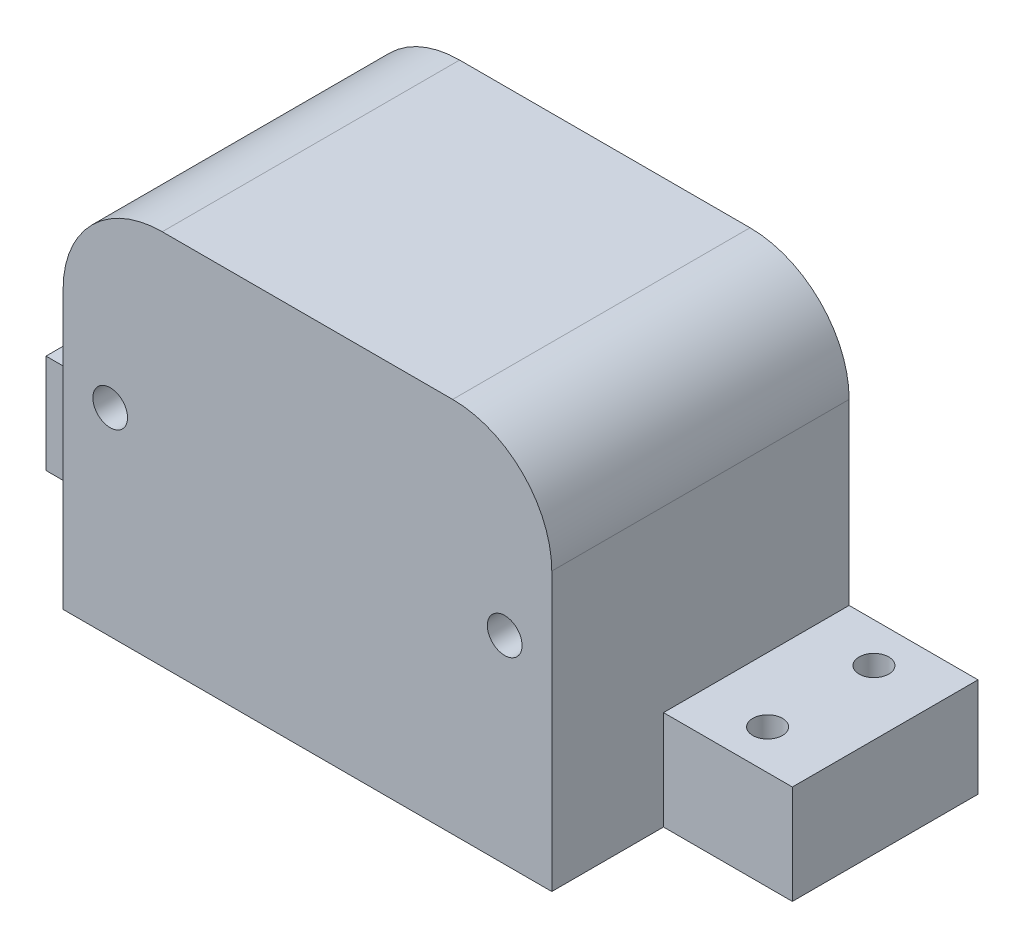
ISO-10303-21;
HEADER;
FILE_DESCRIPTION(('STEP AP214'),'2;1');
FILE_NAME('part.step','',(''),(''),'','','');
FILE_SCHEMA(('AUTOMOTIVE_DESIGN { 1 0 10303 214 1 1 1 1 }'));
ENDSEC;
DATA;
#1=APPLICATION_CONTEXT('core data for automotive mechanical design processes');
#2=APPLICATION_PROTOCOL_DEFINITION('international standard','automotive_design',2000,#1);
#3=PRODUCT_CONTEXT('',#1,'mechanical');
#4=PRODUCT('Part','Part','',(#3));
#5=PRODUCT_RELATED_PRODUCT_CATEGORY('part','',(#4));
#6=PRODUCT_DEFINITION_FORMATION('','',#4);
#7=PRODUCT_DEFINITION_CONTEXT('part definition',#1,'design');
#8=PRODUCT_DEFINITION('design','',#6,#7);
#9=PRODUCT_DEFINITION_SHAPE('','',#8);
#10=(LENGTH_UNIT() NAMED_UNIT(*) SI_UNIT(.MILLI.,.METRE.));
#11=(NAMED_UNIT(*) PLANE_ANGLE_UNIT() SI_UNIT($,.RADIAN.));
#12=(NAMED_UNIT(*) SI_UNIT($,.STERADIAN.) SOLID_ANGLE_UNIT());
#13=UNCERTAINTY_MEASURE_WITH_UNIT(LENGTH_MEASURE(1.E-05),#10,'distance_accuracy_value','');
#14=(GEOMETRIC_REPRESENTATION_CONTEXT(3) GLOBAL_UNCERTAINTY_ASSIGNED_CONTEXT((#13)) GLOBAL_UNIT_ASSIGNED_CONTEXT((#10,
#11,#12)) REPRESENTATION_CONTEXT('',''));
#15=CARTESIAN_POINT('',(0.,0.,0.));
#16=DIRECTION('',(0.,0.,1.));
#17=DIRECTION('',(1.,0.,0.));
#18=AXIS2_PLACEMENT_3D('',#15,#16,#17);
#19=CARTESIAN_POINT('',(0.,-19.,30.));
#20=DIRECTION('',(0.,1.,0.));
#21=DIRECTION('',(0.,0.,1.));
#22=AXIS2_PLACEMENT_3D('',#19,#20,#21);
#23=PLANE('',#22);
#24=CARTESIAN_POINT('',(31.15,-19.,3.99999999999999));
#25=DIRECTION('',(0.,1.,0.));
#26=DIRECTION('',(0.,0.,1.));
#27=AXIS2_PLACEMENT_3D('',#24,#25,#26);
#28=CIRCLE('',#27,1.49999999999999);
#29=CARTESIAN_POINT('',(31.15,-19.,5.49999999999998));
#30=VERTEX_POINT('',#29);
#31=EDGE_CURVE('E244',#30,#30,#28,.T.);
#32=ORIENTED_EDGE('',*,*,#31,.T.);
#33=EDGE_LOOP('',(#32));
#34=FACE_BOUND('',#33,.T.);
#35=CARTESIAN_POINT('',(31.15,-19.,14.7279854884588));
#36=DIRECTION('',(0.,1.,0.));
#37=DIRECTION('',(0.,0.,1.));
#38=AXIS2_PLACEMENT_3D('',#35,#36,#37);
#39=CIRCLE('',#38,1.5);
#40=CARTESIAN_POINT('',(31.15,-19.,16.2279854884588));
#41=VERTEX_POINT('',#40);
#42=EDGE_CURVE('E257',#41,#41,#39,.T.);
#43=ORIENTED_EDGE('',*,*,#42,.T.);
#44=EDGE_LOOP('',(#43));
#45=FACE_BOUND('',#44,.T.);
#46=CARTESIAN_POINT('',(-31.15,-19.,14.7279854884588));
#47=DIRECTION('',(0.,1.,0.));
#48=DIRECTION('',(0.,0.,1.));
#49=AXIS2_PLACEMENT_3D('',#46,#47,#48);
#50=CIRCLE('',#49,1.5);
#51=CARTESIAN_POINT('',(-31.15,-19.,16.2279854884588));
#52=VERTEX_POINT('',#51);
#53=EDGE_CURVE('E260',#52,#52,#50,.T.);
#54=ORIENTED_EDGE('',*,*,#53,.T.);
#55=EDGE_LOOP('',(#54));
#56=FACE_BOUND('',#55,.T.);
#57=CARTESIAN_POINT('',(-31.15,-19.,4.));
#58=DIRECTION('',(0.,1.,0.));
#59=DIRECTION('',(0.,0.,1.));
#60=AXIS2_PLACEMENT_3D('',#57,#58,#59);
#61=CIRCLE('',#60,1.5);
#62=CARTESIAN_POINT('',(-31.15,-19.,5.5));
#63=VERTEX_POINT('',#62);
#64=EDGE_CURVE('E263',#63,#63,#61,.T.);
#65=ORIENTED_EDGE('',*,*,#64,.T.);
#66=EDGE_LOOP('',(#65));
#67=FACE_BOUND('',#66,.T.);
#68=DIRECTION('',(-1.,0.,0.));
#69=VECTOR('',#68,1.);
#70=CARTESIAN_POINT('',(0.,-19.,18.7279854884588));
#71=LINE('',#70,#69);
#72=CARTESIAN_POINT('',(37.65,-19.,18.7279854884588));
#73=VERTEX_POINT('',#72);
#74=CARTESIAN_POINT('',(24.65,-19.,18.7279854884588));
#75=VERTEX_POINT('',#74);
#76=EDGE_CURVE('E242',#73,#75,#71,.T.);
#77=ORIENTED_EDGE('',*,*,#76,.T.);
#78=DIRECTION('',(0.,0.,1.));
#79=VECTOR('',#78,1.);
#80=CARTESIAN_POINT('',(24.65,-19.,30.));
#81=LINE('',#80,#79);
#82=CARTESIAN_POINT('',(24.65,-19.,30.));
#83=VERTEX_POINT('',#82);
#84=EDGE_CURVE('E137',#75,#83,#81,.T.);
#85=ORIENTED_EDGE('',*,*,#84,.T.);
#86=DIRECTION('',(1.,0.,0.));
#87=VECTOR('',#86,1.);
#88=CARTESIAN_POINT('',(0.,-19.,30.));
#89=LINE('',#88,#87);
#90=CARTESIAN_POINT('',(-24.65,-19.,30.));
#91=VERTEX_POINT('',#90);
#92=EDGE_CURVE('E219',#91,#83,#89,.T.);
#93=ORIENTED_EDGE('',*,*,#92,.F.);
#94=DIRECTION('',(0.,0.,-1.));
#95=VECTOR('',#94,1.);
#96=CARTESIAN_POINT('',(-24.65,-19.,30.));
#97=LINE('',#96,#95);
#98=CARTESIAN_POINT('',(-24.65,-19.,18.7279854884588));
#99=VERTEX_POINT('',#98);
#100=EDGE_CURVE('E270',#91,#99,#97,.T.);
#101=ORIENTED_EDGE('',*,*,#100,.T.);
#102=DIRECTION('',(-1.,0.,0.));
#103=VECTOR('',#102,1.);
#104=CARTESIAN_POINT('',(0.,-19.,18.7279854884588));
#105=LINE('',#104,#103);
#106=CARTESIAN_POINT('',(-37.65,-19.,18.7279854884588));
#107=VERTEX_POINT('',#106);
#108=EDGE_CURVE('E266',#99,#107,#105,.T.);
#109=ORIENTED_EDGE('',*,*,#108,.T.);
#110=DIRECTION('',(0.,0.,-1.));
#111=VECTOR('',#110,1.);
#112=CARTESIAN_POINT('',(-37.65,-19.,30.));
#113=LINE('',#112,#111);
#114=CARTESIAN_POINT('',(-37.65,-19.,0.));
#115=VERTEX_POINT('',#114);
#116=EDGE_CURVE('E220',#107,#115,#113,.T.);
#117=ORIENTED_EDGE('',*,*,#116,.T.);
#118=DIRECTION('',(1.,0.,0.));
#119=VECTOR('',#118,1.);
#120=CARTESIAN_POINT('',(0.,-19.,0.));
#121=LINE('',#120,#119);
#122=CARTESIAN_POINT('',(37.65,-19.,0.));
#123=VERTEX_POINT('',#122);
#124=EDGE_CURVE('E238',#115,#123,#121,.T.);
#125=ORIENTED_EDGE('',*,*,#124,.T.);
#126=DIRECTION('',(0.,0.,-1.));
#127=VECTOR('',#126,1.);
#128=CARTESIAN_POINT('',(37.65,-19.,30.));
#129=LINE('',#128,#127);
#130=EDGE_CURVE('E158',#73,#123,#129,.T.);
#131=ORIENTED_EDGE('',*,*,#130,.F.);
#132=EDGE_LOOP('',(#77,#85,#93,#101,#109,#117,#125,#131));
#133=FACE_BOUND('',#132,.T.);
#134=ADVANCED_FACE('F41',(#34,#45,#56,#67,#133),#23,.F.);
#135=CARTESIAN_POINT('',(37.65,0.,30.));
#136=DIRECTION('',(1.,0.,0.));
#137=DIRECTION('',(0.,0.,-1.));
#138=AXIS2_PLACEMENT_3D('',#135,#136,#137);
#139=PLANE('',#138);
#140=DIRECTION('',(0.,1.,0.));
#141=VECTOR('',#140,1.);
#142=CARTESIAN_POINT('',(37.65,-29.,18.7279854884588));
#143=LINE('',#142,#141);
#144=CARTESIAN_POINT('',(37.65,-9.,18.7279854884588));
#145=VERTEX_POINT('',#144);
#146=EDGE_CURVE('E140',#73,#145,#143,.T.);
#147=ORIENTED_EDGE('',*,*,#146,.F.);
#148=ORIENTED_EDGE('',*,*,#130,.T.);
#149=DIRECTION('',(0.,-1.,0.));
#150=VECTOR('',#149,1.);
#151=CARTESIAN_POINT('',(37.65,0.,0.));
#152=LINE('',#151,#150);
#153=CARTESIAN_POINT('',(37.65,-9.00000000000001,0.));
#154=VERTEX_POINT('',#153);
#155=EDGE_CURVE('E201',#154,#123,#152,.T.);
#156=ORIENTED_EDGE('',*,*,#155,.F.);
#157=DIRECTION('',(0.,0.,-1.));
#158=VECTOR('',#157,1.);
#159=CARTESIAN_POINT('',(37.65,-9.00000000000001,30.));
#160=LINE('',#159,#158);
#161=EDGE_CURVE('E155',#145,#154,#160,.T.);
#162=ORIENTED_EDGE('',*,*,#161,.F.);
#163=EDGE_LOOP('',(#147,#148,#156,#162));
#164=FACE_BOUND('',#163,.T.);
#165=ADVANCED_FACE('F310',(#164),#139,.T.);
#166=CARTESIAN_POINT('',(0.,-9.,30.));
#167=DIRECTION('',(0.,1.,0.));
#168=DIRECTION('',(-1.,0.,0.));
#169=AXIS2_PLACEMENT_3D('',#166,#167,#168);
#170=PLANE('',#169);
#171=DIRECTION('',(-1.,0.,0.));
#172=VECTOR('',#171,1.);
#173=CARTESIAN_POINT('',(24.65,-9.,18.7279854884588));
#174=LINE('',#173,#172);
#175=CARTESIAN_POINT('',(24.65,-9.,18.7279854884588));
#176=VERTEX_POINT('',#175);
#177=EDGE_CURVE('E143',#145,#176,#174,.T.);
#178=ORIENTED_EDGE('',*,*,#177,.F.);
#179=ORIENTED_EDGE('',*,*,#161,.T.);
#180=DIRECTION('',(1.,0.,0.));
#181=VECTOR('',#180,1.);
#182=CARTESIAN_POINT('',(0.,-9.,0.));
#183=LINE('',#182,#181);
#184=CARTESIAN_POINT('',(24.65,-9.00000000000001,0.));
#185=VERTEX_POINT('',#184);
#186=EDGE_CURVE('E154',#185,#154,#183,.T.);
#187=ORIENTED_EDGE('',*,*,#186,.F.);
#188=DIRECTION('',(0.,0.,-1.));
#189=VECTOR('',#188,1.);
#190=CARTESIAN_POINT('',(24.65,-9.00000000000001,30.));
#191=LINE('',#190,#189);
#192=EDGE_CURVE('E134',#176,#185,#191,.T.);
#193=ORIENTED_EDGE('',*,*,#192,.F.);
#194=EDGE_LOOP('',(#178,#179,#187,#193));
#195=FACE_BOUND('',#194,.T.);
#196=CARTESIAN_POINT('',(31.15,-9.,3.99999999999999));
#197=DIRECTION('',(0.,1.,0.));
#198=DIRECTION('',(1.,0.,0.));
#199=AXIS2_PLACEMENT_3D('',#196,#197,#198);
#200=CIRCLE('',#199,1.49999999999999);
#201=CARTESIAN_POINT('',(32.65,-9.,3.99999999999999));
#202=VERTEX_POINT('',#201);
#203=EDGE_CURVE('E148',#202,#202,#200,.T.);
#204=ORIENTED_EDGE('',*,*,#203,.F.);
#205=EDGE_LOOP('',(#204));
#206=FACE_BOUND('',#205,.T.);
#207=CARTESIAN_POINT('',(31.15,-9.,14.7279854884588));
#208=DIRECTION('',(0.,1.,0.));
#209=DIRECTION('',(1.,0.,0.));
#210=AXIS2_PLACEMENT_3D('',#207,#208,#209);
#211=CIRCLE('',#210,1.5);
#212=CARTESIAN_POINT('',(32.65,-9.,14.7279854884588));
#213=VERTEX_POINT('',#212);
#214=EDGE_CURVE('E282',#213,#213,#211,.T.);
#215=ORIENTED_EDGE('',*,*,#214,.F.);
#216=EDGE_LOOP('',(#215));
#217=FACE_BOUND('',#216,.T.);
#218=ADVANCED_FACE('F151',(#195,#206,#217),#170,.T.);
#219=CARTESIAN_POINT('',(24.65,0.,30.));
#220=DIRECTION('',(-1.,0.,0.));
#221=DIRECTION('',(0.,0.,1.));
#222=AXIS2_PLACEMENT_3D('',#219,#220,#221);
#223=PLANE('',#222);
#224=DIRECTION('',(0.,1.,0.));
#225=VECTOR('',#224,1.);
#226=CARTESIAN_POINT('',(24.65,0.,0.));
#227=LINE('',#226,#225);
#228=CARTESIAN_POINT('',(24.65,9.,0.));
#229=VERTEX_POINT('',#228);
#230=EDGE_CURVE('E196',#185,#229,#227,.T.);
#231=ORIENTED_EDGE('',*,*,#230,.T.);
#232=DIRECTION('',(0.,0.,-1.));
#233=VECTOR('',#232,1.);
#234=CARTESIAN_POINT('',(24.65,9.,30.));
#235=LINE('',#234,#233);
#236=CARTESIAN_POINT('',(24.65,9.,30.));
#237=VERTEX_POINT('',#236);
#238=EDGE_CURVE('E174',#229,#237,#235,.F.);
#239=ORIENTED_EDGE('',*,*,#238,.T.);
#240=DIRECTION('',(0.,1.,0.));
#241=VECTOR('',#240,1.);
#242=CARTESIAN_POINT('',(24.65,0.,30.));
#243=LINE('',#242,#241);
#244=EDGE_CURVE('E182',#83,#237,#243,.T.);
#245=ORIENTED_EDGE('',*,*,#244,.F.);
#246=ORIENTED_EDGE('',*,*,#84,.F.);
#247=DIRECTION('',(0.,1.,0.));
#248=VECTOR('',#247,1.);
#249=CARTESIAN_POINT('',(24.65,-29.,18.7279854884588));
#250=LINE('',#249,#248);
#251=EDGE_CURVE('E129',#75,#176,#250,.T.);
#252=ORIENTED_EDGE('',*,*,#251,.T.);
#253=ORIENTED_EDGE('',*,*,#192,.T.);
#254=EDGE_LOOP('',(#231,#239,#245,#246,#252,#253));
#255=FACE_BOUND('',#254,.T.);
#256=ADVANCED_FACE('F132',(#255),#223,.F.);
#257=CARTESIAN_POINT('',(0.,19.,30.));
#258=DIRECTION('',(0.,1.,0.));
#259=DIRECTION('',(0.,0.,1.));
#260=AXIS2_PLACEMENT_3D('',#257,#258,#259);
#261=PLANE('',#260);
#262=DIRECTION('',(1.,0.,0.));
#263=VECTOR('',#262,1.);
#264=CARTESIAN_POINT('',(0.,19.,30.));
#265=LINE('',#264,#263);
#266=CARTESIAN_POINT('',(-14.65,19.,30.));
#267=VERTEX_POINT('',#266);
#268=CARTESIAN_POINT('',(14.65,19.,30.));
#269=VERTEX_POINT('',#268);
#270=EDGE_CURVE('E181',#267,#269,#265,.T.);
#271=ORIENTED_EDGE('',*,*,#270,.T.);
#272=DIRECTION('',(0.,0.,-1.));
#273=VECTOR('',#272,1.);
#274=CARTESIAN_POINT('',(14.65,19.,0.));
#275=LINE('',#274,#273);
#276=CARTESIAN_POINT('',(14.65,19.,0.));
#277=VERTEX_POINT('',#276);
#278=EDGE_CURVE('E167',#269,#277,#275,.T.);
#279=ORIENTED_EDGE('',*,*,#278,.T.);
#280=DIRECTION('',(1.,0.,0.));
#281=VECTOR('',#280,1.);
#282=CARTESIAN_POINT('',(0.,19.,0.));
#283=LINE('',#282,#281);
#284=CARTESIAN_POINT('',(-14.65,19.,0.));
#285=VERTEX_POINT('',#284);
#286=EDGE_CURVE('E197',#285,#277,#283,.T.);
#287=ORIENTED_EDGE('',*,*,#286,.F.);
#288=DIRECTION('',(0.,0.,-1.));
#289=VECTOR('',#288,1.);
#290=CARTESIAN_POINT('',(-14.65,19.,30.));
#291=LINE('',#290,#289);
#292=EDGE_CURVE('E165',#285,#267,#291,.F.);
#293=ORIENTED_EDGE('',*,*,#292,.T.);
#294=EDGE_LOOP('',(#271,#279,#287,#293));
#295=FACE_BOUND('',#294,.T.);
#296=ADVANCED_FACE('F187',(#295),#261,.T.);
#297=CARTESIAN_POINT('',(-24.65,0.,30.));
#298=DIRECTION('',(-1.,0.,0.));
#299=DIRECTION('',(0.,0.,1.));
#300=AXIS2_PLACEMENT_3D('',#297,#298,#299);
#301=PLANE('',#300);
#302=DIRECTION('',(0.,1.,0.));
#303=VECTOR('',#302,1.);
#304=CARTESIAN_POINT('',(-24.65,0.,30.));
#305=LINE('',#304,#303);
#306=CARTESIAN_POINT('',(-24.65,9.,30.));
#307=VERTEX_POINT('',#306);
#308=EDGE_CURVE('E56',#91,#307,#305,.T.);
#309=ORIENTED_EDGE('',*,*,#308,.T.);
#310=DIRECTION('',(0.,0.,-1.));
#311=VECTOR('',#310,1.);
#312=CARTESIAN_POINT('',(-24.65,9.,30.));
#313=LINE('',#312,#311);
#314=CARTESIAN_POINT('',(-24.65,9.,0.));
#315=VERTEX_POINT('',#314);
#316=EDGE_CURVE('E11',#307,#315,#313,.T.);
#317=ORIENTED_EDGE('',*,*,#316,.T.);
#318=DIRECTION('',(0.,1.,0.));
#319=VECTOR('',#318,1.);
#320=CARTESIAN_POINT('',(-24.65,0.,0.));
#321=LINE('',#320,#319);
#322=CARTESIAN_POINT('',(-24.65,-9.00000000000001,0.));
#323=VERTEX_POINT('',#322);
#324=EDGE_CURVE('E199',#323,#315,#321,.T.);
#325=ORIENTED_EDGE('',*,*,#324,.F.);
#326=DIRECTION('',(0.,0.,-1.));
#327=VECTOR('',#326,1.);
#328=CARTESIAN_POINT('',(-24.65,-9.00000000000001,30.));
#329=LINE('',#328,#327);
#330=CARTESIAN_POINT('',(-24.65,-9.00000000000001,18.7279854884588));
#331=VERTEX_POINT('',#330);
#332=EDGE_CURVE('E156',#331,#323,#329,.T.);
#333=ORIENTED_EDGE('',*,*,#332,.F.);
#334=DIRECTION('',(0.,1.,0.));
#335=VECTOR('',#334,1.);
#336=CARTESIAN_POINT('',(-24.65,-29.,18.7279854884588));
#337=LINE('',#336,#335);
#338=EDGE_CURVE('E273',#99,#331,#337,.T.);
#339=ORIENTED_EDGE('',*,*,#338,.F.);
#340=ORIENTED_EDGE('',*,*,#100,.F.);
#341=EDGE_LOOP('',(#309,#317,#325,#333,#339,#340));
#342=FACE_BOUND('',#341,.T.);
#343=ADVANCED_FACE('F296',(#342),#301,.T.);
#344=CARTESIAN_POINT('',(0.,-9.,30.));
#345=DIRECTION('',(0.,-1.,0.));
#346=DIRECTION('',(1.,0.,0.));
#347=AXIS2_PLACEMENT_3D('',#344,#345,#346);
#348=PLANE('',#347);
#349=CARTESIAN_POINT('',(-31.15,-9.00000000000001,14.7279854884588));
#350=DIRECTION('',(0.,1.,0.));
#351=DIRECTION('',(-1.,0.,0.));
#352=AXIS2_PLACEMENT_3D('',#349,#350,#351);
#353=CIRCLE('',#352,1.5);
#354=CARTESIAN_POINT('',(-32.65,-9.00000000000001,14.7279854884588));
#355=VERTEX_POINT('',#354);
#356=EDGE_CURVE('E285',#355,#355,#353,.T.);
#357=ORIENTED_EDGE('',*,*,#356,.F.);
#358=EDGE_LOOP('',(#357));
#359=FACE_BOUND('',#358,.T.);
#360=CARTESIAN_POINT('',(-31.15,-9.00000000000001,4.));
#361=DIRECTION('',(0.,1.,0.));
#362=DIRECTION('',(-1.,0.,0.));
#363=AXIS2_PLACEMENT_3D('',#360,#361,#362);
#364=CIRCLE('',#363,1.5);
#365=CARTESIAN_POINT('',(-32.65,-9.00000000000001,4.));
#366=VERTEX_POINT('',#365);
#367=EDGE_CURVE('E277',#366,#366,#364,.T.);
#368=ORIENTED_EDGE('',*,*,#367,.F.);
#369=EDGE_LOOP('',(#368));
#370=FACE_BOUND('',#369,.T.);
#371=DIRECTION('',(0.,0.,-1.));
#372=VECTOR('',#371,1.);
#373=CARTESIAN_POINT('',(-37.65,-9.00000000000001,30.));
#374=LINE('',#373,#372);
#375=CARTESIAN_POINT('',(-37.65,-9.00000000000001,18.7279854884588));
#376=VERTEX_POINT('',#375);
#377=CARTESIAN_POINT('',(-37.65,-9.00000000000001,0.));
#378=VERTEX_POINT('',#377);
#379=EDGE_CURVE('E160',#376,#378,#374,.T.);
#380=ORIENTED_EDGE('',*,*,#379,.F.);
#381=DIRECTION('',(-1.,0.,0.));
#382=VECTOR('',#381,1.);
#383=CARTESIAN_POINT('',(-24.65,-9.00000000000001,18.7279854884588));
#384=LINE('',#383,#382);
#385=EDGE_CURVE('E275',#331,#376,#384,.T.);
#386=ORIENTED_EDGE('',*,*,#385,.F.);
#387=ORIENTED_EDGE('',*,*,#332,.T.);
#388=DIRECTION('',(-1.,0.,0.));
#389=VECTOR('',#388,1.);
#390=CARTESIAN_POINT('',(0.,-9.,0.));
#391=LINE('',#390,#389);
#392=EDGE_CURVE('E207',#323,#378,#391,.T.);
#393=ORIENTED_EDGE('',*,*,#392,.T.);
#394=EDGE_LOOP('',(#380,#386,#387,#393));
#395=FACE_BOUND('',#394,.T.);
#396=ADVANCED_FACE('F233',(#359,#370,#395),#348,.F.);
#397=CARTESIAN_POINT('',(-19.9,1.,30.));
#398=DIRECTION('',(0.,0.,-1.));
#399=DIRECTION('',(-1.,0.,0.));
#400=AXIS2_PLACEMENT_3D('',#397,#398,#399);
#401=CYLINDRICAL_SURFACE('',#400,1.75);
#402=CARTESIAN_POINT('',(-19.9,1.,30.));
#403=DIRECTION('',(0.,0.,1.));
#404=DIRECTION('',(1.,0.,0.));
#405=AXIS2_PLACEMENT_3D('',#402,#403,#404);
#406=CIRCLE('',#405,1.75);
#407=CARTESIAN_POINT('',(-18.15,1.,30.));
#408=VERTEX_POINT('',#407);
#409=EDGE_CURVE('E249',#408,#408,#406,.T.);
#410=ORIENTED_EDGE('',*,*,#409,.T.);
#411=EDGE_LOOP('',(#410));
#412=FACE_BOUND('',#411,.T.);
#413=CARTESIAN_POINT('',(-19.9,1.,0.));
#414=DIRECTION('',(0.,0.,1.));
#415=DIRECTION('',(1.,0.,0.));
#416=AXIS2_PLACEMENT_3D('',#413,#414,#415);
#417=CIRCLE('',#416,1.75);
#418=CARTESIAN_POINT('',(-18.15,1.,0.));
#419=VERTEX_POINT('',#418);
#420=EDGE_CURVE('E213',#419,#419,#417,.T.);
#421=ORIENTED_EDGE('',*,*,#420,.F.);
#422=EDGE_LOOP('',(#421));
#423=FACE_BOUND('',#422,.T.);
#424=ADVANCED_FACE('F295',(#412,#423),#401,.F.);
#425=CARTESIAN_POINT('',(-37.65,0.,30.));
#426=DIRECTION('',(1.,0.,0.));
#427=DIRECTION('',(0.,0.,-1.));
#428=AXIS2_PLACEMENT_3D('',#425,#426,#427);
#429=PLANE('',#428);
#430=ORIENTED_EDGE('',*,*,#116,.F.);
#431=DIRECTION('',(0.,1.,0.));
#432=VECTOR('',#431,1.);
#433=CARTESIAN_POINT('',(-37.65,-29.,18.7279854884588));
#434=LINE('',#433,#432);
#435=EDGE_CURVE('E229',#107,#376,#434,.T.);
#436=ORIENTED_EDGE('',*,*,#435,.T.);
#437=ORIENTED_EDGE('',*,*,#379,.T.);
#438=DIRECTION('',(0.,-1.,0.));
#439=VECTOR('',#438,1.);
#440=CARTESIAN_POINT('',(-37.65,0.,0.));
#441=LINE('',#440,#439);
#442=EDGE_CURVE('E210',#378,#115,#441,.T.);
#443=ORIENTED_EDGE('',*,*,#442,.T.);
#444=EDGE_LOOP('',(#430,#436,#437,#443));
#445=FACE_BOUND('',#444,.T.);
#446=ADVANCED_FACE('F226',(#445),#429,.F.);
#447=CARTESIAN_POINT('',(19.9,1.,30.));
#448=DIRECTION('',(0.,0.,-1.));
#449=DIRECTION('',(-1.,0.,0.));
#450=AXIS2_PLACEMENT_3D('',#447,#448,#449);
#451=CYLINDRICAL_SURFACE('',#450,1.75);
#452=CARTESIAN_POINT('',(19.9,1.,30.));
#453=DIRECTION('',(0.,0.,1.));
#454=DIRECTION('',(1.,0.,0.));
#455=AXIS2_PLACEMENT_3D('',#452,#453,#454);
#456=CIRCLE('',#455,1.75);
#457=CARTESIAN_POINT('',(21.65,1.,30.));
#458=VERTEX_POINT('',#457);
#459=EDGE_CURVE('E221',#458,#458,#456,.F.);
#460=ORIENTED_EDGE('',*,*,#459,.F.);
#461=EDGE_LOOP('',(#460));
#462=FACE_BOUND('',#461,.T.);
#463=CARTESIAN_POINT('',(19.9,1.,0.));
#464=DIRECTION('',(0.,0.,1.));
#465=DIRECTION('',(1.,0.,0.));
#466=AXIS2_PLACEMENT_3D('',#463,#464,#465);
#467=CIRCLE('',#466,1.75);
#468=CARTESIAN_POINT('',(21.65,1.,0.));
#469=VERTEX_POINT('',#468);
#470=EDGE_CURVE('E216',#469,#469,#467,.F.);
#471=ORIENTED_EDGE('',*,*,#470,.T.);
#472=EDGE_LOOP('',(#471));
#473=FACE_BOUND('',#472,.T.);
#474=ADVANCED_FACE('F331',(#462,#473),#451,.F.);
#475=CARTESIAN_POINT('',(0.,0.,30.));
#476=DIRECTION('',(0.,0.,1.));
#477=DIRECTION('',(1.,0.,0.));
#478=AXIS2_PLACEMENT_3D('',#475,#476,#477);
#479=PLANE('',#478);
#480=ORIENTED_EDGE('',*,*,#92,.T.);
#481=ORIENTED_EDGE('',*,*,#244,.T.);
#482=CARTESIAN_POINT('',(14.65,9.,30.));
#483=DIRECTION('',(0.,0.,1.));
#484=DIRECTION('',(1.,0.,0.));
#485=AXIS2_PLACEMENT_3D('',#482,#483,#484);
#486=CIRCLE('',#485,10.);
#487=EDGE_CURVE('E49',#237,#269,#486,.T.);
#488=ORIENTED_EDGE('',*,*,#487,.T.);
#489=ORIENTED_EDGE('',*,*,#270,.F.);
#490=CARTESIAN_POINT('',(-14.65,9.,30.));
#491=DIRECTION('',(0.,0.,1.));
#492=DIRECTION('',(1.,0.,0.));
#493=AXIS2_PLACEMENT_3D('',#490,#491,#492);
#494=CIRCLE('',#493,10.);
#495=EDGE_CURVE('E61',#267,#307,#494,.T.);
#496=ORIENTED_EDGE('',*,*,#495,.T.);
#497=ORIENTED_EDGE('',*,*,#308,.F.);
#498=EDGE_LOOP('',(#480,#481,#488,#489,#496,#497));
#499=FACE_BOUND('',#498,.T.);
#500=ORIENTED_EDGE('',*,*,#409,.F.);
#501=EDGE_LOOP('',(#500));
#502=FACE_BOUND('',#501,.T.);
#503=ORIENTED_EDGE('',*,*,#459,.T.);
#504=EDGE_LOOP('',(#503));
#505=FACE_BOUND('',#504,.T.);
#506=ADVANCED_FACE('F179',(#499,#502,#505),#479,.T.);
#507=CARTESIAN_POINT('',(0.,0.,0.));
#508=DIRECTION('',(0.,0.,1.));
#509=DIRECTION('',(1.,0.,0.));
#510=AXIS2_PLACEMENT_3D('',#507,#508,#509);
#511=PLANE('',#510);
#512=ORIENTED_EDGE('',*,*,#286,.T.);
#513=CARTESIAN_POINT('',(14.65,9.,0.));
#514=DIRECTION('',(0.,0.,1.));
#515=DIRECTION('',(1.,0.,0.));
#516=AXIS2_PLACEMENT_3D('',#513,#514,#515);
#517=CIRCLE('',#516,10.);
#518=EDGE_CURVE('E172',#277,#229,#517,.F.);
#519=ORIENTED_EDGE('',*,*,#518,.T.);
#520=ORIENTED_EDGE('',*,*,#230,.F.);
#521=ORIENTED_EDGE('',*,*,#186,.T.);
#522=ORIENTED_EDGE('',*,*,#155,.T.);
#523=ORIENTED_EDGE('',*,*,#124,.F.);
#524=ORIENTED_EDGE('',*,*,#442,.F.);
#525=ORIENTED_EDGE('',*,*,#392,.F.);
#526=ORIENTED_EDGE('',*,*,#324,.T.);
#527=CARTESIAN_POINT('',(-14.65,9.,0.));
#528=DIRECTION('',(0.,0.,1.));
#529=DIRECTION('',(1.,0.,0.));
#530=AXIS2_PLACEMENT_3D('',#527,#528,#529);
#531=CIRCLE('',#530,10.);
#532=EDGE_CURVE('E170',#315,#285,#531,.F.);
#533=ORIENTED_EDGE('',*,*,#532,.T.);
#534=EDGE_LOOP('',(#512,#519,#520,#521,#522,#523,#524,#525,#526,#533));
#535=FACE_BOUND('',#534,.T.);
#536=ORIENTED_EDGE('',*,*,#420,.T.);
#537=EDGE_LOOP('',(#536));
#538=FACE_BOUND('',#537,.T.);
#539=ORIENTED_EDGE('',*,*,#470,.F.);
#540=EDGE_LOOP('',(#539));
#541=FACE_BOUND('',#540,.T.);
#542=ADVANCED_FACE('F194',(#535,#538,#541),#511,.F.);
#543=CARTESIAN_POINT('',(14.65,9.,30.));
#544=DIRECTION('',(0.,0.,1.));
#545=DIRECTION('',(1.,0.,0.));
#546=AXIS2_PLACEMENT_3D('',#543,#544,#545);
#547=CYLINDRICAL_SURFACE('',#546,10.);
#548=ORIENTED_EDGE('',*,*,#487,.F.);
#549=ORIENTED_EDGE('',*,*,#238,.F.);
#550=ORIENTED_EDGE('',*,*,#518,.F.);
#551=ORIENTED_EDGE('',*,*,#278,.F.);
#552=EDGE_LOOP('',(#548,#549,#550,#551));
#553=FACE_BOUND('',#552,.T.);
#554=ADVANCED_FACE('F192',(#553),#547,.T.);
#555=CARTESIAN_POINT('',(-14.65,9.,30.));
#556=DIRECTION('',(0.,0.,-1.));
#557=DIRECTION('',(-1.,0.,0.));
#558=AXIS2_PLACEMENT_3D('',#555,#556,#557);
#559=CYLINDRICAL_SURFACE('',#558,10.);
#560=ORIENTED_EDGE('',*,*,#495,.F.);
#561=ORIENTED_EDGE('',*,*,#292,.F.);
#562=ORIENTED_EDGE('',*,*,#532,.F.);
#563=ORIENTED_EDGE('',*,*,#316,.F.);
#564=EDGE_LOOP('',(#560,#561,#562,#563));
#565=FACE_BOUND('',#564,.T.);
#566=ADVANCED_FACE('F43',(#565),#559,.T.);
#567=CARTESIAN_POINT('',(-24.65,-29.,18.7279854884588));
#568=DIRECTION('',(0.,0.,-1.));
#569=DIRECTION('',(-1.,0.,0.));
#570=AXIS2_PLACEMENT_3D('',#567,#568,#569);
#571=PLANE('',#570);
#572=ORIENTED_EDGE('',*,*,#338,.T.);
#573=ORIENTED_EDGE('',*,*,#385,.T.);
#574=ORIENTED_EDGE('',*,*,#435,.F.);
#575=ORIENTED_EDGE('',*,*,#108,.F.);
#576=EDGE_LOOP('',(#572,#573,#574,#575));
#577=FACE_BOUND('',#576,.T.);
#578=ADVANCED_FACE('F325',(#577),#571,.F.);
#579=CARTESIAN_POINT('',(24.65,-29.,18.7279854884588));
#580=DIRECTION('',(0.,0.,-1.));
#581=DIRECTION('',(-1.,0.,0.));
#582=AXIS2_PLACEMENT_3D('',#579,#580,#581);
#583=PLANE('',#582);
#584=ORIENTED_EDGE('',*,*,#146,.T.);
#585=ORIENTED_EDGE('',*,*,#177,.T.);
#586=ORIENTED_EDGE('',*,*,#251,.F.);
#587=ORIENTED_EDGE('',*,*,#76,.F.);
#588=EDGE_LOOP('',(#584,#585,#586,#587));
#589=FACE_BOUND('',#588,.T.);
#590=ADVANCED_FACE('F144',(#589),#583,.F.);
#591=CARTESIAN_POINT('',(-31.15,-29.,4.));
#592=DIRECTION('',(0.,1.,0.));
#593=DIRECTION('',(-1.,0.,0.));
#594=AXIS2_PLACEMENT_3D('',#591,#592,#593);
#595=CYLINDRICAL_SURFACE('',#594,1.5);
#596=ORIENTED_EDGE('',*,*,#367,.T.);
#597=EDGE_LOOP('',(#596));
#598=FACE_BOUND('',#597,.T.);
#599=ORIENTED_EDGE('',*,*,#64,.F.);
#600=EDGE_LOOP('',(#599));
#601=FACE_BOUND('',#600,.T.);
#602=ADVANCED_FACE('F291',(#598,#601),#595,.F.);
#603=CARTESIAN_POINT('',(-31.15,-29.,14.7279854884588));
#604=DIRECTION('',(0.,1.,0.));
#605=DIRECTION('',(-1.,0.,0.));
#606=AXIS2_PLACEMENT_3D('',#603,#604,#605);
#607=CYLINDRICAL_SURFACE('',#606,1.5);
#608=ORIENTED_EDGE('',*,*,#356,.T.);
#609=EDGE_LOOP('',(#608));
#610=FACE_BOUND('',#609,.T.);
#611=ORIENTED_EDGE('',*,*,#53,.F.);
#612=EDGE_LOOP('',(#611));
#613=FACE_BOUND('',#612,.T.);
#614=ADVANCED_FACE('F381',(#610,#613),#607,.F.);
#615=CARTESIAN_POINT('',(31.15,-29.,14.7279854884588));
#616=DIRECTION('',(0.,1.,0.));
#617=DIRECTION('',(-1.,0.,0.));
#618=AXIS2_PLACEMENT_3D('',#615,#616,#617);
#619=CYLINDRICAL_SURFACE('',#618,1.5);
#620=ORIENTED_EDGE('',*,*,#214,.T.);
#621=EDGE_LOOP('',(#620));
#622=FACE_BOUND('',#621,.T.);
#623=ORIENTED_EDGE('',*,*,#42,.F.);
#624=EDGE_LOOP('',(#623));
#625=FACE_BOUND('',#624,.T.);
#626=ADVANCED_FACE('F391',(#622,#625),#619,.F.);
#627=CARTESIAN_POINT('',(31.15,-29.,3.99999999999999));
#628=DIRECTION('',(0.,1.,0.));
#629=DIRECTION('',(-1.,0.,0.));
#630=AXIS2_PLACEMENT_3D('',#627,#628,#629);
#631=CYLINDRICAL_SURFACE('',#630,1.49999999999999);
#632=ORIENTED_EDGE('',*,*,#203,.T.);
#633=EDGE_LOOP('',(#632));
#634=FACE_BOUND('',#633,.T.);
#635=ORIENTED_EDGE('',*,*,#31,.F.);
#636=EDGE_LOOP('',(#635));
#637=FACE_BOUND('',#636,.T.);
#638=ADVANCED_FACE('F402',(#634,#637),#631,.F.);
#639=CLOSED_SHELL('',(#134,#165,#218,#256,#296,#343,#396,#424,#446,#474,#506,#542,#554,#566,
#578,#590,#602,#614,#626,#638));
#640=MANIFOLD_SOLID_BREP('B2',#639);
#641=ADVANCED_BREP_SHAPE_REPRESENTATION('',(#18,#640),#14);
#642=SHAPE_DEFINITION_REPRESENTATION(#9,#641);
ENDSEC;
END-ISO-10303-21;
